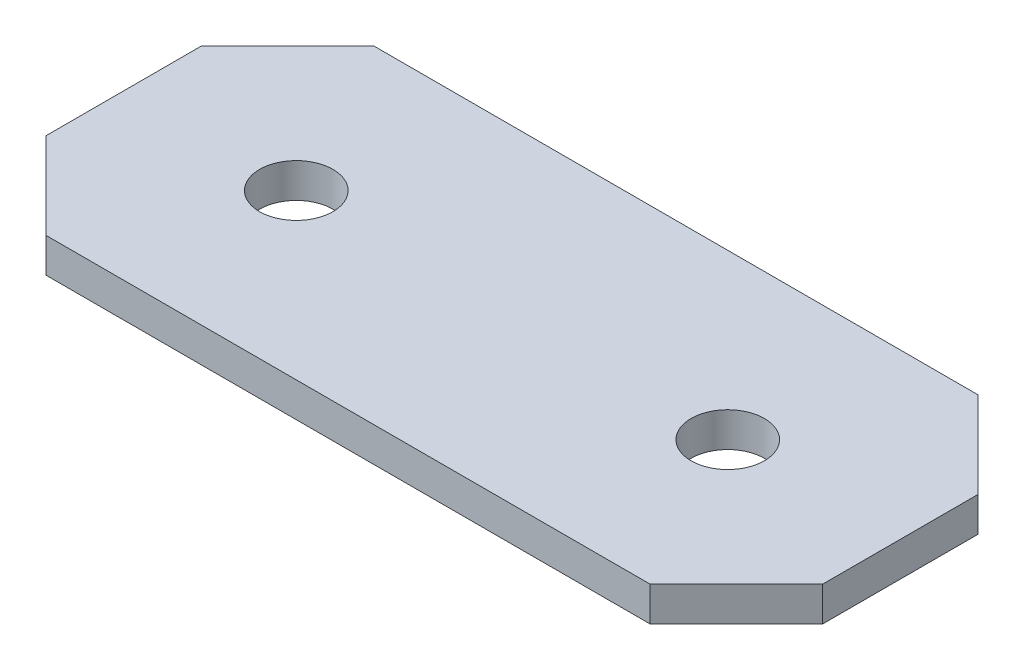
ISO-10303-21;
HEADER;
FILE_DESCRIPTION(('STEP AP214'),'2;1');
FILE_NAME('part.step','',(''),(''),'','','');
FILE_SCHEMA(('AUTOMOTIVE_DESIGN { 1 0 10303 214 1 1 1 1 }'));
ENDSEC;
DATA;
#1=APPLICATION_CONTEXT('core data for automotive mechanical design processes');
#2=APPLICATION_PROTOCOL_DEFINITION('international standard','automotive_design',2000,#1);
#3=PRODUCT_CONTEXT('',#1,'mechanical');
#4=PRODUCT('Part','Part','',(#3));
#5=PRODUCT_RELATED_PRODUCT_CATEGORY('part','',(#4));
#6=PRODUCT_DEFINITION_FORMATION('','',#4);
#7=PRODUCT_DEFINITION_CONTEXT('part definition',#1,'design');
#8=PRODUCT_DEFINITION('design','',#6,#7);
#9=PRODUCT_DEFINITION_SHAPE('','',#8);
#10=(LENGTH_UNIT() NAMED_UNIT(*) SI_UNIT(.MILLI.,.METRE.));
#11=(NAMED_UNIT(*) PLANE_ANGLE_UNIT() SI_UNIT($,.RADIAN.));
#12=(NAMED_UNIT(*) SI_UNIT($,.STERADIAN.) SOLID_ANGLE_UNIT());
#13=UNCERTAINTY_MEASURE_WITH_UNIT(LENGTH_MEASURE(1.E-05),#10,'distance_accuracy_value','');
#14=(GEOMETRIC_REPRESENTATION_CONTEXT(3) GLOBAL_UNCERTAINTY_ASSIGNED_CONTEXT((#13)) GLOBAL_UNIT_ASSIGNED_CONTEXT((#10,
#11,#12)) REPRESENTATION_CONTEXT('',''));
#15=CARTESIAN_POINT('',(0.,0.,0.));
#16=DIRECTION('',(0.,0.,1.));
#17=DIRECTION('',(1.,0.,0.));
#18=AXIS2_PLACEMENT_3D('',#15,#16,#17);
#19=CARTESIAN_POINT('',(0.,4.,0.));
#20=DIRECTION('',(0.,-1.,0.));
#21=DIRECTION('',(0.,0.,-1.));
#22=AXIS2_PLACEMENT_3D('',#19,#20,#21);
#23=PLANE('',#22);
#24=DIRECTION('',(-0.707106781186548,0.,0.707106781186547));
#25=VECTOR('',#24,1.);
#26=CARTESIAN_POINT('',(-35.,4.,-19.));
#27=LINE('',#26,#25);
#28=CARTESIAN_POINT('',(-35.,4.,-19.));
#29=VERTEX_POINT('',#28);
#30=CARTESIAN_POINT('',(-45.,4.,-9.));
#31=VERTEX_POINT('',#30);
#32=EDGE_CURVE('E144',#29,#31,#27,.T.);
#33=ORIENTED_EDGE('',*,*,#32,.T.);
#34=DIRECTION('',(0.,0.,1.));
#35=VECTOR('',#34,1.);
#36=CARTESIAN_POINT('',(-45.,4.,9.));
#37=LINE('',#36,#35);
#38=CARTESIAN_POINT('',(-45.,4.,9.));
#39=VERTEX_POINT('',#38);
#40=EDGE_CURVE('E92',#31,#39,#37,.T.);
#41=ORIENTED_EDGE('',*,*,#40,.T.);
#42=DIRECTION('',(0.707106781186548,0.,0.707106781186547));
#43=VECTOR('',#42,1.);
#44=CARTESIAN_POINT('',(-35.,4.,19.));
#45=LINE('',#44,#43);
#46=CARTESIAN_POINT('',(-35.,4.,19.));
#47=VERTEX_POINT('',#46);
#48=EDGE_CURVE('E159',#39,#47,#45,.T.);
#49=ORIENTED_EDGE('',*,*,#48,.T.);
#50=DIRECTION('',(1.,0.,0.));
#51=VECTOR('',#50,1.);
#52=CARTESIAN_POINT('',(35.,4.,19.));
#53=LINE('',#52,#51);
#54=CARTESIAN_POINT('',(35.,4.,19.));
#55=VERTEX_POINT('',#54);
#56=EDGE_CURVE('E172',#47,#55,#53,.T.);
#57=ORIENTED_EDGE('',*,*,#56,.T.);
#58=DIRECTION('',(0.707106781186549,0.,-0.707106781186546));
#59=VECTOR('',#58,1.);
#60=CARTESIAN_POINT('',(35.,4.,19.));
#61=LINE('',#60,#59);
#62=CARTESIAN_POINT('',(45.,4.,9.));
#63=VERTEX_POINT('',#62);
#64=EDGE_CURVE('E111',#55,#63,#61,.T.);
#65=ORIENTED_EDGE('',*,*,#64,.T.);
#66=DIRECTION('',(0.,0.,-1.));
#67=VECTOR('',#66,1.);
#68=CARTESIAN_POINT('',(45.,4.,9.));
#69=LINE('',#68,#67);
#70=CARTESIAN_POINT('',(45.,4.,-9.));
#71=VERTEX_POINT('',#70);
#72=EDGE_CURVE('E105',#63,#71,#69,.T.);
#73=ORIENTED_EDGE('',*,*,#72,.T.);
#74=DIRECTION('',(-0.707106781186549,0.,-0.707106781186547));
#75=VECTOR('',#74,1.);
#76=CARTESIAN_POINT('',(45.,4.,-9.));
#77=LINE('',#76,#75);
#78=CARTESIAN_POINT('',(35.,4.,-19.));
#79=VERTEX_POINT('',#78);
#80=EDGE_CURVE('E109',#71,#79,#77,.T.);
#81=ORIENTED_EDGE('',*,*,#80,.T.);
#82=DIRECTION('',(-1.,0.,0.));
#83=VECTOR('',#82,1.);
#84=CARTESIAN_POINT('',(35.,4.,-19.));
#85=LINE('',#84,#83);
#86=EDGE_CURVE('E49',#79,#29,#85,.T.);
#87=ORIENTED_EDGE('',*,*,#86,.T.);
#88=EDGE_LOOP('',(#33,#41,#49,#57,#65,#73,#81,#87));
#89=FACE_BOUND('',#88,.T.);
#90=CARTESIAN_POINT('',(25.,4.,0.));
#91=DIRECTION('',(0.,1.,0.));
#92=DIRECTION('',(0.,0.,1.));
#93=AXIS2_PLACEMENT_3D('',#90,#91,#92);
#94=CIRCLE('',#93,4.25000000000001);
#95=CARTESIAN_POINT('',(25.,4.,4.25000000000001));
#96=VERTEX_POINT('',#95);
#97=EDGE_CURVE('E133',#96,#96,#94,.T.);
#98=ORIENTED_EDGE('',*,*,#97,.F.);
#99=EDGE_LOOP('',(#98));
#100=FACE_BOUND('',#99,.T.);
#101=CARTESIAN_POINT('',(-25.,4.,0.));
#102=DIRECTION('',(0.,1.,0.));
#103=DIRECTION('',(0.,0.,1.));
#104=AXIS2_PLACEMENT_3D('',#101,#102,#103);
#105=CIRCLE('',#104,4.25);
#106=CARTESIAN_POINT('',(-25.,4.,4.25));
#107=VERTEX_POINT('',#106);
#108=EDGE_CURVE('E181',#107,#107,#105,.T.);
#109=ORIENTED_EDGE('',*,*,#108,.F.);
#110=EDGE_LOOP('',(#109));
#111=FACE_BOUND('',#110,.T.);
#112=ADVANCED_FACE('F32',(#89,#100,#111),#23,.F.);
#113=CARTESIAN_POINT('',(0.,0.,0.));
#114=DIRECTION('',(0.,-1.,0.));
#115=DIRECTION('',(0.,0.,-1.));
#116=AXIS2_PLACEMENT_3D('',#113,#114,#115);
#117=PLANE('',#116);
#118=CARTESIAN_POINT('',(25.,0.,0.));
#119=DIRECTION('',(0.,1.,0.));
#120=DIRECTION('',(0.,0.,1.));
#121=AXIS2_PLACEMENT_3D('',#118,#119,#120);
#122=CIRCLE('',#121,4.25000000000001);
#123=CARTESIAN_POINT('',(25.,0.,4.25000000000001));
#124=VERTEX_POINT('',#123);
#125=EDGE_CURVE('E178',#124,#124,#122,.T.);
#126=ORIENTED_EDGE('',*,*,#125,.T.);
#127=EDGE_LOOP('',(#126));
#128=FACE_BOUND('',#127,.T.);
#129=DIRECTION('',(-0.707106781186548,0.,0.707106781186547));
#130=VECTOR('',#129,1.);
#131=CARTESIAN_POINT('',(-35.,0.,-19.));
#132=LINE('',#131,#130);
#133=CARTESIAN_POINT('',(-35.,0.,-19.));
#134=VERTEX_POINT('',#133);
#135=CARTESIAN_POINT('',(-45.,0.,-9.));
#136=VERTEX_POINT('',#135);
#137=EDGE_CURVE('E129',#134,#136,#132,.T.);
#138=ORIENTED_EDGE('',*,*,#137,.F.);
#139=DIRECTION('',(-1.,0.,0.));
#140=VECTOR('',#139,1.);
#141=CARTESIAN_POINT('',(35.,0.,-19.));
#142=LINE('',#141,#140);
#143=CARTESIAN_POINT('',(35.,0.,-19.));
#144=VERTEX_POINT('',#143);
#145=EDGE_CURVE('E84',#144,#134,#142,.T.);
#146=ORIENTED_EDGE('',*,*,#145,.F.);
#147=DIRECTION('',(-0.707106781186549,0.,-0.707106781186547));
#148=VECTOR('',#147,1.);
#149=CARTESIAN_POINT('',(45.,0.,-9.));
#150=LINE('',#149,#148);
#151=CARTESIAN_POINT('',(45.,0.,-9.));
#152=VERTEX_POINT('',#151);
#153=EDGE_CURVE('E78',#152,#144,#150,.T.);
#154=ORIENTED_EDGE('',*,*,#153,.F.);
#155=DIRECTION('',(0.,0.,-1.));
#156=VECTOR('',#155,1.);
#157=CARTESIAN_POINT('',(45.,0.,9.));
#158=LINE('',#157,#156);
#159=CARTESIAN_POINT('',(45.,0.,9.));
#160=VERTEX_POINT('',#159);
#161=EDGE_CURVE('E119',#160,#152,#158,.T.);
#162=ORIENTED_EDGE('',*,*,#161,.F.);
#163=DIRECTION('',(0.707106781186549,0.,-0.707106781186546));
#164=VECTOR('',#163,1.);
#165=CARTESIAN_POINT('',(35.,0.,19.));
#166=LINE('',#165,#164);
#167=CARTESIAN_POINT('',(35.,0.,19.));
#168=VERTEX_POINT('',#167);
#169=EDGE_CURVE('E139',#168,#160,#166,.T.);
#170=ORIENTED_EDGE('',*,*,#169,.F.);
#171=DIRECTION('',(1.,0.,0.));
#172=VECTOR('',#171,1.);
#173=CARTESIAN_POINT('',(35.,0.,19.));
#174=LINE('',#173,#172);
#175=CARTESIAN_POINT('',(-35.,0.,19.));
#176=VERTEX_POINT('',#175);
#177=EDGE_CURVE('E137',#176,#168,#174,.T.);
#178=ORIENTED_EDGE('',*,*,#177,.F.);
#179=DIRECTION('',(0.707106781186548,0.,0.707106781186547));
#180=VECTOR('',#179,1.);
#181=CARTESIAN_POINT('',(-35.,0.,19.));
#182=LINE('',#181,#180);
#183=CARTESIAN_POINT('',(-45.,0.,9.));
#184=VERTEX_POINT('',#183);
#185=EDGE_CURVE('E135',#184,#176,#182,.T.);
#186=ORIENTED_EDGE('',*,*,#185,.F.);
#187=DIRECTION('',(0.,0.,1.));
#188=VECTOR('',#187,1.);
#189=CARTESIAN_POINT('',(-45.,0.,9.));
#190=LINE('',#189,#188);
#191=EDGE_CURVE('E132',#136,#184,#190,.T.);
#192=ORIENTED_EDGE('',*,*,#191,.F.);
#193=EDGE_LOOP('',(#138,#146,#154,#162,#170,#178,#186,#192));
#194=FACE_BOUND('',#193,.T.);
#195=CARTESIAN_POINT('',(-25.,0.,0.));
#196=DIRECTION('',(0.,1.,0.));
#197=DIRECTION('',(0.,0.,1.));
#198=AXIS2_PLACEMENT_3D('',#195,#196,#197);
#199=CIRCLE('',#198,4.25);
#200=CARTESIAN_POINT('',(-25.,0.,4.25));
#201=VERTEX_POINT('',#200);
#202=EDGE_CURVE('E184',#201,#201,#199,.T.);
#203=ORIENTED_EDGE('',*,*,#202,.T.);
#204=EDGE_LOOP('',(#203));
#205=FACE_BOUND('',#204,.T.);
#206=ADVANCED_FACE('F163',(#128,#194,#205),#117,.T.);
#207=CARTESIAN_POINT('',(-35.,4.,-19.));
#208=DIRECTION('',(0.707106781186547,0.,0.707106781186548));
#209=DIRECTION('',(0.707106781186548,0.,-0.707106781186547));
#210=AXIS2_PLACEMENT_3D('',#207,#208,#209);
#211=PLANE('',#210);
#212=ORIENTED_EDGE('',*,*,#137,.T.);
#213=DIRECTION('',(0.,-1.,0.));
#214=VECTOR('',#213,1.);
#215=CARTESIAN_POINT('',(-45.,4.,-9.));
#216=LINE('',#215,#214);
#217=EDGE_CURVE('E11',#31,#136,#216,.T.);
#218=ORIENTED_EDGE('',*,*,#217,.F.);
#219=ORIENTED_EDGE('',*,*,#32,.F.);
#220=DIRECTION('',(0.,-1.,0.));
#221=VECTOR('',#220,1.);
#222=CARTESIAN_POINT('',(-35.,4.,-19.));
#223=LINE('',#222,#221);
#224=EDGE_CURVE('E125',#29,#134,#223,.T.);
#225=ORIENTED_EDGE('',*,*,#224,.T.);
#226=EDGE_LOOP('',(#212,#218,#219,#225));
#227=FACE_BOUND('',#226,.T.);
#228=ADVANCED_FACE('F34',(#227),#211,.F.);
#229=CARTESIAN_POINT('',(-45.,4.,9.));
#230=DIRECTION('',(1.,0.,0.));
#231=DIRECTION('',(0.,0.,-1.));
#232=AXIS2_PLACEMENT_3D('',#229,#230,#231);
#233=PLANE('',#232);
#234=ORIENTED_EDGE('',*,*,#191,.T.);
#235=DIRECTION('',(0.,-1.,0.));
#236=VECTOR('',#235,1.);
#237=CARTESIAN_POINT('',(-45.,4.,9.));
#238=LINE('',#237,#236);
#239=EDGE_CURVE('E41',#39,#184,#238,.T.);
#240=ORIENTED_EDGE('',*,*,#239,.F.);
#241=ORIENTED_EDGE('',*,*,#40,.F.);
#242=ORIENTED_EDGE('',*,*,#217,.T.);
#243=EDGE_LOOP('',(#234,#240,#241,#242));
#244=FACE_BOUND('',#243,.T.);
#245=ADVANCED_FACE('F216',(#244),#233,.F.);
#246=CARTESIAN_POINT('',(-35.,4.,19.));
#247=DIRECTION('',(0.707106781186547,0.,-0.707106781186548));
#248=DIRECTION('',(-0.707106781186548,0.,-0.707106781186547));
#249=AXIS2_PLACEMENT_3D('',#246,#247,#248);
#250=PLANE('',#249);
#251=ORIENTED_EDGE('',*,*,#185,.T.);
#252=DIRECTION('',(0.,-1.,0.));
#253=VECTOR('',#252,1.);
#254=CARTESIAN_POINT('',(-35.,4.,19.));
#255=LINE('',#254,#253);
#256=EDGE_CURVE('E151',#47,#176,#255,.T.);
#257=ORIENTED_EDGE('',*,*,#256,.F.);
#258=ORIENTED_EDGE('',*,*,#48,.F.);
#259=ORIENTED_EDGE('',*,*,#239,.T.);
#260=EDGE_LOOP('',(#251,#257,#258,#259));
#261=FACE_BOUND('',#260,.T.);
#262=ADVANCED_FACE('F157',(#261),#250,.F.);
#263=CARTESIAN_POINT('',(35.,4.,19.));
#264=DIRECTION('',(0.,0.,-1.));
#265=DIRECTION('',(-1.,0.,0.));
#266=AXIS2_PLACEMENT_3D('',#263,#264,#265);
#267=PLANE('',#266);
#268=ORIENTED_EDGE('',*,*,#177,.T.);
#269=DIRECTION('',(0.,-1.,0.));
#270=VECTOR('',#269,1.);
#271=CARTESIAN_POINT('',(35.,4.,19.));
#272=LINE('',#271,#270);
#273=EDGE_CURVE('E148',#55,#168,#272,.T.);
#274=ORIENTED_EDGE('',*,*,#273,.F.);
#275=ORIENTED_EDGE('',*,*,#56,.F.);
#276=ORIENTED_EDGE('',*,*,#256,.T.);
#277=EDGE_LOOP('',(#268,#274,#275,#276));
#278=FACE_BOUND('',#277,.T.);
#279=ADVANCED_FACE('F168',(#278),#267,.F.);
#280=CARTESIAN_POINT('',(35.,4.,19.));
#281=DIRECTION('',(-0.707106781186546,0.,-0.707106781186549));
#282=DIRECTION('',(-0.707106781186549,0.,0.707106781186546));
#283=AXIS2_PLACEMENT_3D('',#280,#281,#282);
#284=PLANE('',#283);
#285=ORIENTED_EDGE('',*,*,#169,.T.);
#286=DIRECTION('',(0.,-1.,0.));
#287=VECTOR('',#286,1.);
#288=CARTESIAN_POINT('',(45.,4.,9.));
#289=LINE('',#288,#287);
#290=EDGE_CURVE('E120',#63,#160,#289,.T.);
#291=ORIENTED_EDGE('',*,*,#290,.F.);
#292=ORIENTED_EDGE('',*,*,#64,.F.);
#293=ORIENTED_EDGE('',*,*,#273,.T.);
#294=EDGE_LOOP('',(#285,#291,#292,#293));
#295=FACE_BOUND('',#294,.T.);
#296=ADVANCED_FACE('F171',(#295),#284,.F.);
#297=CARTESIAN_POINT('',(45.,4.,9.));
#298=DIRECTION('',(-1.,0.,0.));
#299=DIRECTION('',(0.,0.,1.));
#300=AXIS2_PLACEMENT_3D('',#297,#298,#299);
#301=PLANE('',#300);
#302=ORIENTED_EDGE('',*,*,#161,.T.);
#303=DIRECTION('',(0.,-1.,0.));
#304=VECTOR('',#303,1.);
#305=CARTESIAN_POINT('',(45.,4.,-9.));
#306=LINE('',#305,#304);
#307=EDGE_CURVE('E116',#71,#152,#306,.T.);
#308=ORIENTED_EDGE('',*,*,#307,.F.);
#309=ORIENTED_EDGE('',*,*,#72,.F.);
#310=ORIENTED_EDGE('',*,*,#290,.T.);
#311=EDGE_LOOP('',(#302,#308,#309,#310));
#312=FACE_BOUND('',#311,.T.);
#313=ADVANCED_FACE('F117',(#312),#301,.F.);
#314=CARTESIAN_POINT('',(45.,4.,-9.));
#315=DIRECTION('',(-0.707106781186547,0.,0.707106781186549));
#316=DIRECTION('',(0.707106781186549,0.,0.707106781186547));
#317=AXIS2_PLACEMENT_3D('',#314,#315,#316);
#318=PLANE('',#317);
#319=ORIENTED_EDGE('',*,*,#153,.T.);
#320=DIRECTION('',(0.,-1.,0.));
#321=VECTOR('',#320,1.);
#322=CARTESIAN_POINT('',(35.,4.,-19.));
#323=LINE('',#322,#321);
#324=EDGE_CURVE('E121',#79,#144,#323,.T.);
#325=ORIENTED_EDGE('',*,*,#324,.F.);
#326=ORIENTED_EDGE('',*,*,#80,.F.);
#327=ORIENTED_EDGE('',*,*,#307,.T.);
#328=EDGE_LOOP('',(#319,#325,#326,#327));
#329=FACE_BOUND('',#328,.T.);
#330=ADVANCED_FACE('F123',(#329),#318,.F.);
#331=CARTESIAN_POINT('',(35.,4.,-19.));
#332=DIRECTION('',(0.,0.,1.));
#333=DIRECTION('',(1.,0.,0.));
#334=AXIS2_PLACEMENT_3D('',#331,#332,#333);
#335=PLANE('',#334);
#336=ORIENTED_EDGE('',*,*,#145,.T.);
#337=ORIENTED_EDGE('',*,*,#224,.F.);
#338=ORIENTED_EDGE('',*,*,#86,.F.);
#339=ORIENTED_EDGE('',*,*,#324,.T.);
#340=EDGE_LOOP('',(#336,#337,#338,#339));
#341=FACE_BOUND('',#340,.T.);
#342=ADVANCED_FACE('F204',(#341),#335,.F.);
#343=CARTESIAN_POINT('',(25.,4.,0.));
#344=DIRECTION('',(0.,-1.,0.));
#345=DIRECTION('',(0.,0.,-1.));
#346=AXIS2_PLACEMENT_3D('',#343,#344,#345);
#347=CYLINDRICAL_SURFACE('',#346,4.25000000000001);
#348=ORIENTED_EDGE('',*,*,#97,.T.);
#349=EDGE_LOOP('',(#348));
#350=FACE_BOUND('',#349,.T.);
#351=ORIENTED_EDGE('',*,*,#125,.F.);
#352=EDGE_LOOP('',(#351));
#353=FACE_BOUND('',#352,.T.);
#354=ADVANCED_FACE('F201',(#350,#353),#347,.F.);
#355=CARTESIAN_POINT('',(-25.,4.,0.));
#356=DIRECTION('',(0.,-1.,0.));
#357=DIRECTION('',(0.,0.,-1.));
#358=AXIS2_PLACEMENT_3D('',#355,#356,#357);
#359=CYLINDRICAL_SURFACE('',#358,4.25);
#360=ORIENTED_EDGE('',*,*,#108,.T.);
#361=EDGE_LOOP('',(#360));
#362=FACE_BOUND('',#361,.T.);
#363=ORIENTED_EDGE('',*,*,#202,.F.);
#364=EDGE_LOOP('',(#363));
#365=FACE_BOUND('',#364,.T.);
#366=ADVANCED_FACE('F190',(#362,#365),#359,.F.);
#367=CLOSED_SHELL('',(#112,#206,#228,#245,#262,#279,#296,#313,#330,#342,#354,#366));
#368=MANIFOLD_SOLID_BREP('B2',#367);
#369=ADVANCED_BREP_SHAPE_REPRESENTATION('',(#18,#368),#14);
#370=SHAPE_DEFINITION_REPRESENTATION(#9,#369);
ENDSEC;
END-ISO-10303-21;
